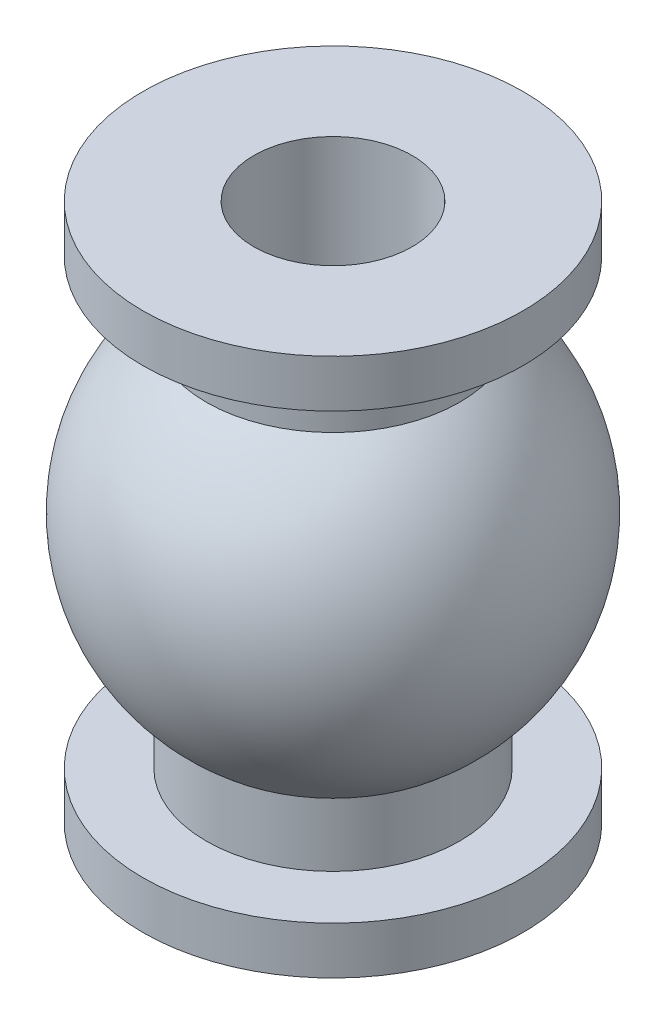
ISO-10303-21;
HEADER;
FILE_DESCRIPTION(('STEP AP214'),'2;1');
FILE_NAME('part.step','',(''),(''),'','','');
FILE_SCHEMA(('AUTOMOTIVE_DESIGN { 1 0 10303 214 1 1 1 1 }'));
ENDSEC;
DATA;
#1=APPLICATION_CONTEXT('core data for automotive mechanical design processes');
#2=APPLICATION_PROTOCOL_DEFINITION('international standard','automotive_design',2000,#1);
#3=PRODUCT_CONTEXT('',#1,'mechanical');
#4=PRODUCT('Part','Part','',(#3));
#5=PRODUCT_RELATED_PRODUCT_CATEGORY('part','',(#4));
#6=PRODUCT_DEFINITION_FORMATION('','',#4);
#7=PRODUCT_DEFINITION_CONTEXT('part definition',#1,'design');
#8=PRODUCT_DEFINITION('design','',#6,#7);
#9=PRODUCT_DEFINITION_SHAPE('','',#8);
#10=(LENGTH_UNIT() NAMED_UNIT(*) SI_UNIT(.MILLI.,.METRE.));
#11=(NAMED_UNIT(*) PLANE_ANGLE_UNIT() SI_UNIT($,.RADIAN.));
#12=(NAMED_UNIT(*) SI_UNIT($,.STERADIAN.) SOLID_ANGLE_UNIT());
#13=UNCERTAINTY_MEASURE_WITH_UNIT(LENGTH_MEASURE(1.E-05),#10,'distance_accuracy_value','');
#14=(GEOMETRIC_REPRESENTATION_CONTEXT(3) GLOBAL_UNCERTAINTY_ASSIGNED_CONTEXT((#13)) GLOBAL_UNIT_ASSIGNED_CONTEXT((#10,
#11,#12)) REPRESENTATION_CONTEXT('',''));
#15=CARTESIAN_POINT('',(0.,0.,0.));
#16=DIRECTION('',(0.,0.,1.));
#17=DIRECTION('',(1.,0.,0.));
#18=AXIS2_PLACEMENT_3D('',#15,#16,#17);
#19=CARTESIAN_POINT('',(0.,16.1142112906296,0.));
#20=DIRECTION('',(0.,1.,0.));
#21=DIRECTION('',(0.,0.,1.));
#22=AXIS2_PLACEMENT_3D('',#19,#20,#21);
#23=CYLINDRICAL_SURFACE('',#22,6.);
#24=CARTESIAN_POINT('',(0.,7.,0.));
#25=DIRECTION('',(0.,1.,0.));
#26=DIRECTION('',(0.,0.,1.));
#27=AXIS2_PLACEMENT_3D('',#24,#25,#26);
#28=CIRCLE('',#27,6.);
#29=CARTESIAN_POINT('',(0.,7.,6.));
#30=VERTEX_POINT('',#29);
#31=EDGE_CURVE('E10',#30,#30,#28,.T.);
#32=ORIENTED_EDGE('',*,*,#31,.T.);
#33=EDGE_LOOP('',(#32));
#34=FACE_BOUND('',#33,.T.);
#35=CARTESIAN_POINT('',(0.,8.5,0.));
#36=DIRECTION('',(0.,1.,0.));
#37=DIRECTION('',(0.,0.,1.));
#38=AXIS2_PLACEMENT_3D('',#35,#36,#37);
#39=CIRCLE('',#38,6.);
#40=CARTESIAN_POINT('',(0.,8.5,6.));
#41=VERTEX_POINT('',#40);
#42=EDGE_CURVE('E59',#41,#41,#39,.T.);
#43=ORIENTED_EDGE('',*,*,#42,.F.);
#44=EDGE_LOOP('',(#43));
#45=FACE_BOUND('',#44,.T.);
#46=ADVANCED_FACE('F31',(#34,#45),#23,.T.);
#47=CARTESIAN_POINT('',(-6.,7.,0.));
#48=DIRECTION('',(0.,-1.,0.));
#49=DIRECTION('',(0.,0.,-1.));
#50=AXIS2_PLACEMENT_3D('',#47,#48,#49);
#51=PLANE('',#50);
#52=CARTESIAN_POINT('',(0.,7.,0.));
#53=DIRECTION('',(0.,1.,0.));
#54=DIRECTION('',(0.,0.,1.));
#55=AXIS2_PLACEMENT_3D('',#52,#53,#54);
#56=CIRCLE('',#55,4.);
#57=CARTESIAN_POINT('',(0.,7.,4.));
#58=VERTEX_POINT('',#57);
#59=EDGE_CURVE('E37',#58,#58,#56,.T.);
#60=ORIENTED_EDGE('',*,*,#59,.T.);
#61=EDGE_LOOP('',(#60));
#62=FACE_BOUND('',#61,.T.);
#63=ORIENTED_EDGE('',*,*,#31,.F.);
#64=EDGE_LOOP('',(#63));
#65=FACE_BOUND('',#64,.T.);
#66=ADVANCED_FACE('F85',(#62,#65),#51,.T.);
#67=CARTESIAN_POINT('',(0.,16.1142112906296,0.));
#68=DIRECTION('',(0.,1.,0.));
#69=DIRECTION('',(0.,0.,1.));
#70=AXIS2_PLACEMENT_3D('',#67,#68,#69);
#71=CYLINDRICAL_SURFACE('',#70,4.);
#72=CARTESIAN_POINT('',(0.,5.,0.));
#73=DIRECTION('',(0.,1.,0.));
#74=DIRECTION('',(0.,0.,1.));
#75=AXIS2_PLACEMENT_3D('',#72,#73,#74);
#76=CIRCLE('',#75,4.);
#77=CARTESIAN_POINT('',(-4.,5.,0.));
#78=VERTEX_POINT('',#77);
#79=EDGE_CURVE('E41',#78,#78,#76,.T.);
#80=ORIENTED_EDGE('',*,*,#79,.T.);
#81=EDGE_LOOP('',(#80));
#82=FACE_BOUND('',#81,.T.);
#83=ORIENTED_EDGE('',*,*,#59,.F.);
#84=EDGE_LOOP('',(#83));
#85=FACE_BOUND('',#84,.T.);
#86=ADVANCED_FACE('F89',(#82,#85),#71,.T.);
#87=CARTESIAN_POINT('',(0.,0.,0.));
#88=DIRECTION('',(0.,1.,0.));
#89=DIRECTION('',(-1.,0.,0.));
#90=AXIS2_PLACEMENT_3D('',#87,#88,#89);
#91=SPHERICAL_SURFACE('',#90,6.40312423743285);
#92=CARTESIAN_POINT('',(0.,-5.,0.));
#93=DIRECTION('',(0.,1.,0.));
#94=DIRECTION('',(0.,0.,1.));
#95=AXIS2_PLACEMENT_3D('',#92,#93,#94);
#96=CIRCLE('',#95,4.);
#97=CARTESIAN_POINT('',(-4.,-5.,0.));
#98=VERTEX_POINT('',#97);
#99=EDGE_CURVE('E45',#98,#98,#96,.T.);
#100=CARTESIAN_POINT('',(-4.,-5.,0.));
#101=CARTESIAN_POINT('',(-4.09334161361375,-4.92533152943418,0.));
#102=CARTESIAN_POINT('',(-4.1845873974265,-4.8480438566984,0.));
#103=CARTESIAN_POINT('',(-4.36261224403933,-4.68848477215426,0.));
#104=CARTESIAN_POINT('',(-4.44939130683942,-4.60621336034591,0.));
#105=CARTESIAN_POINT('',(-4.6182076500163,-4.43694146292396,0.));
#106=CARTESIAN_POINT('',(-4.70024493039309,-4.34994097731036,0.));
#107=CARTESIAN_POINT('',(-4.85932126831225,-4.17148461308061,0.));
#108=CARTESIAN_POINT('',(-4.93636032585461,-4.08002873446446,0.));
#109=CARTESIAN_POINT('',(-5.08519844439702,-3.89294811326265,0.));
#110=CARTESIAN_POINT('',(-5.15699750539705,-3.79732337067699,0.));
#111=CARTESIAN_POINT('',(-5.29513055695284,-3.60220492295348,0.));
#112=CARTESIAN_POINT('',(-5.36146454750858,-3.50271121781564,0.));
#113=CARTESIAN_POINT('',(-5.48845944817778,-3.3001667972475,0.));
#114=CARTESIAN_POINT('',(-5.54912035829123,-3.1971160818172,0.));
#115=CARTESIAN_POINT('',(-5.66457889575253,-2.98778076775581,0.));
#116=CARTESIAN_POINT('',(-5.71937652310039,-2.88149616912472,0.));
#117=CARTESIAN_POINT('',(-5.8229366722458,-2.66602635003076,0.));
#118=CARTESIAN_POINT('',(-5.87169919404337,-2.5568411295679,0.));
#119=CARTESIAN_POINT('',(-5.96303623417655,-2.33591242482622,0.));
#120=CARTESIAN_POINT('',(-6.00561075251216,-2.22416894054742,0.));
#121=CARTESIAN_POINT('',(-6.08443829034353,-1.99847408738474,0.));
#122=CARTESIAN_POINT('',(-6.1206913098393,-1.88452271850086,0.));
#123=CARTESIAN_POINT('',(-6.18676217620255,-1.65476939842258,0.));
#124=CARTESIAN_POINT('',(-6.21658002307004,-1.53896744722818,0.));
#125=CARTESIAN_POINT('',(-6.26968704828328,-1.30587606742035,0.));
#126=CARTESIAN_POINT('',(-6.29297622662902,-1.18858663880692,0.));
#127=CARTESIAN_POINT('',(-6.33295288999685,-0.952888073147173,0.));
#128=CARTESIAN_POINT('',(-6.34964037501893,-0.834478936100859,0.));
#129=CARTESIAN_POINT('',(-6.37636132699423,-0.596912233481334,0.));
#130=CARTESIAN_POINT('',(-6.38639479394745,-0.477754667908125,0.));
#131=CARTESIAN_POINT('',(-6.39977624916676,-0.239064734889943,0.));
#132=CARTESIAN_POINT('',(-6.40312423743285,-0.11953236744497,0.));
#133=CARTESIAN_POINT('',(-6.40312423743285,0.119532367444975,0.));
#134=CARTESIAN_POINT('',(-6.39977624916676,0.239064734889947,0.));
#135=CARTESIAN_POINT('',(-6.38639479394745,0.477754667908129,0.));
#136=CARTESIAN_POINT('',(-6.37636132699423,0.596912233481338,0.));
#137=CARTESIAN_POINT('',(-6.34964037501893,0.834478936100862,0.));
#138=CARTESIAN_POINT('',(-6.33295288999685,0.952888073147177,0.));
#139=CARTESIAN_POINT('',(-6.29297622662902,1.18858663880692,0.));
#140=CARTESIAN_POINT('',(-6.26968704828328,1.30587606742035,0.));
#141=CARTESIAN_POINT('',(-6.21658002307004,1.53896744722818,0.));
#142=CARTESIAN_POINT('',(-6.18676217620255,1.65476939842258,0.));
#143=CARTESIAN_POINT('',(-6.12069130983929,1.88452271850086,0.));
#144=CARTESIAN_POINT('',(-6.08443829034353,1.99847408738474,0.));
#145=CARTESIAN_POINT('',(-6.00561075251216,2.22416894054742,0.));
#146=CARTESIAN_POINT('',(-5.96303623417655,2.33591242482623,0.));
#147=CARTESIAN_POINT('',(-5.87169919404337,2.5568411295679,0.));
#148=CARTESIAN_POINT('',(-5.8229366722458,2.66602635003076,0.));
#149=CARTESIAN_POINT('',(-5.71937652310038,2.88149616912472,0.));
#150=CARTESIAN_POINT('',(-5.66457889575253,2.98778076775582,0.));
#151=CARTESIAN_POINT('',(-5.54912035829123,3.19711608181721,0.));
#152=CARTESIAN_POINT('',(-5.48845944817778,3.3001667972475,0.));
#153=CARTESIAN_POINT('',(-5.36146454750858,3.50271121781564,0.));
#154=CARTESIAN_POINT('',(-5.29513055695283,3.60220492295349,0.));
#155=CARTESIAN_POINT('',(-5.15699750539705,3.79732337067699,0.));
#156=CARTESIAN_POINT('',(-5.08519844439701,3.89294811326265,0.));
#157=CARTESIAN_POINT('',(-4.93636032585461,4.08002873446447,0.));
#158=CARTESIAN_POINT('',(-4.85932126831225,4.17148461308062,0.));
#159=CARTESIAN_POINT('',(-4.70024493039309,4.34994097731036,0.));
#160=CARTESIAN_POINT('',(-4.6182076500163,4.43694146292396,0.));
#161=CARTESIAN_POINT('',(-4.44939130683942,4.60621336034591,0.));
#162=CARTESIAN_POINT('',(-4.36261224403933,4.68848477215427,0.));
#163=CARTESIAN_POINT('',(-4.18458739742649,4.8480438566984,0.));
#164=CARTESIAN_POINT('',(-4.09334161361375,4.92533152943418,0.));
#165=CARTESIAN_POINT('',(-4.,5.,0.));
#166=B_SPLINE_CURVE_WITH_KNOTS('',3,(#100,#101,#102,#103,#104,#105,#106,#107,#108,#109,#110,
#111,#112,#113,#114,#115,#116,#117,#118,#119,#120,#121,#122,#123,#124,#125,#126,#127,#128,#129,
#130,#131,#132,#133,#134,#135,#136,#137,#138,#139,#140,#141,#142,#143,#144,#145,#146,#147,#148,
#149,#150,#151,#152,#153,#154,#155,#156,#157,#158,#159,#160,#161,#162,#163,#164,#165),
.UNSPECIFIED.,.F.,.F.,(4,2,2,2,2,2,2,2,2,2,2,2,2,2,2,2,2,2,2,2,2,2,2,2,2,2,2,2,2,2,2,2,4),(0.,
0.358550261293141,0.717100522586282,1.07565078387942,1.43420104517257,1.79275130646571,
2.15130156775885,2.50985182905199,2.86840209034513,3.22695235163827,3.58550261293141,
3.94405287422455,4.3026031355177,4.66115339681084,5.01970365810398,5.37825391939712,
5.73680418069026,6.0953544419834,6.45390470327655,6.81245496456969,7.17100522586283,
7.52955548715597,7.88810574844911,8.24665600974225,8.60520627103539,8.96375653232854,
9.32230679362168,9.68085705491482,10.039407316208,10.3979575775011,10.7565078387942,
11.1150581000874,11.4736083613805),.UNSPECIFIED.);
#167=EDGE_CURVE('BSEAM93',#98,#78,#166,.T.);
#168=ORIENTED_EDGE('',*,*,#99,.T.);
#169=ORIENTED_EDGE('',*,*,#79,.F.);
#170=ORIENTED_EDGE('',*,*,#167,.T.);
#171=ORIENTED_EDGE('',*,*,#167,.F.);
#172=EDGE_LOOP('',(#168,#170,#169,#171));
#173=FACE_BOUND('',#172,.T.);
#174=ADVANCED_FACE('F93',(#173),#91,.T.);
#175=CARTESIAN_POINT('',(0.,16.1142112906296,0.));
#176=DIRECTION('',(0.,1.,0.));
#177=DIRECTION('',(0.,0.,1.));
#178=AXIS2_PLACEMENT_3D('',#175,#176,#177);
#179=CYLINDRICAL_SURFACE('',#178,4.);
#180=CARTESIAN_POINT('',(0.,-7.,0.));
#181=DIRECTION('',(0.,1.,0.));
#182=DIRECTION('',(0.,0.,1.));
#183=AXIS2_PLACEMENT_3D('',#180,#181,#182);
#184=CIRCLE('',#183,4.);
#185=CARTESIAN_POINT('',(0.,-7.,4.));
#186=VERTEX_POINT('',#185);
#187=EDGE_CURVE('E50',#186,#186,#184,.T.);
#188=ORIENTED_EDGE('',*,*,#187,.T.);
#189=EDGE_LOOP('',(#188));
#190=FACE_BOUND('',#189,.T.);
#191=ORIENTED_EDGE('',*,*,#99,.F.);
#192=EDGE_LOOP('',(#191));
#193=FACE_BOUND('',#192,.T.);
#194=ADVANCED_FACE('F100',(#190,#193),#179,.T.);
#195=CARTESIAN_POINT('',(-6.,-7.,0.));
#196=DIRECTION('',(0.,1.,0.));
#197=DIRECTION('',(0.,0.,1.));
#198=AXIS2_PLACEMENT_3D('',#195,#196,#197);
#199=PLANE('',#198);
#200=CARTESIAN_POINT('',(0.,-7.,0.));
#201=DIRECTION('',(0.,1.,0.));
#202=DIRECTION('',(0.,0.,1.));
#203=AXIS2_PLACEMENT_3D('',#200,#201,#202);
#204=CIRCLE('',#203,6.);
#205=CARTESIAN_POINT('',(0.,-7.,6.));
#206=VERTEX_POINT('',#205);
#207=EDGE_CURVE('E53',#206,#206,#204,.T.);
#208=ORIENTED_EDGE('',*,*,#207,.T.);
#209=EDGE_LOOP('',(#208));
#210=FACE_BOUND('',#209,.T.);
#211=ORIENTED_EDGE('',*,*,#187,.F.);
#212=EDGE_LOOP('',(#211));
#213=FACE_BOUND('',#212,.T.);
#214=ADVANCED_FACE('F104',(#210,#213),#199,.T.);
#215=CARTESIAN_POINT('',(0.,16.1142112906296,0.));
#216=DIRECTION('',(0.,1.,0.));
#217=DIRECTION('',(0.,0.,1.));
#218=AXIS2_PLACEMENT_3D('',#215,#216,#217);
#219=CYLINDRICAL_SURFACE('',#218,6.);
#220=CARTESIAN_POINT('',(0.,-8.5,0.));
#221=DIRECTION('',(0.,1.,0.));
#222=DIRECTION('',(0.,0.,1.));
#223=AXIS2_PLACEMENT_3D('',#220,#221,#222);
#224=CIRCLE('',#223,6.);
#225=CARTESIAN_POINT('',(0.,-8.5,6.));
#226=VERTEX_POINT('',#225);
#227=EDGE_CURVE('E56',#226,#226,#224,.T.);
#228=ORIENTED_EDGE('',*,*,#227,.T.);
#229=EDGE_LOOP('',(#228));
#230=FACE_BOUND('',#229,.T.);
#231=ORIENTED_EDGE('',*,*,#207,.F.);
#232=EDGE_LOOP('',(#231));
#233=FACE_BOUND('',#232,.T.);
#234=ADVANCED_FACE('F108',(#230,#233),#219,.T.);
#235=CARTESIAN_POINT('',(0.,-8.5,0.));
#236=DIRECTION('',(0.,-1.,0.));
#237=DIRECTION('',(0.,0.,-1.));
#238=AXIS2_PLACEMENT_3D('',#235,#236,#237);
#239=PLANE('',#238);
#240=CARTESIAN_POINT('',(0.,-8.5,0.));
#241=DIRECTION('',(0.,1.,0.));
#242=DIRECTION('',(0.,0.,1.));
#243=AXIS2_PLACEMENT_3D('',#240,#241,#242);
#244=CIRCLE('',#243,2.5);
#245=CARTESIAN_POINT('',(0.,-8.5,2.5));
#246=VERTEX_POINT('',#245);
#247=EDGE_CURVE('E62',#246,#246,#244,.T.);
#248=ORIENTED_EDGE('',*,*,#247,.T.);
#249=EDGE_LOOP('',(#248));
#250=FACE_BOUND('',#249,.T.);
#251=ORIENTED_EDGE('',*,*,#227,.F.);
#252=EDGE_LOOP('',(#251));
#253=FACE_BOUND('',#252,.T.);
#254=ADVANCED_FACE('F69',(#250,#253),#239,.T.);
#255=CARTESIAN_POINT('',(0.,8.5,0.));
#256=DIRECTION('',(0.,1.,0.));
#257=DIRECTION('',(0.,0.,1.));
#258=AXIS2_PLACEMENT_3D('',#255,#256,#257);
#259=PLANE('',#258);
#260=CARTESIAN_POINT('',(0.,8.5,0.));
#261=DIRECTION('',(0.,1.,0.));
#262=DIRECTION('',(0.,0.,1.));
#263=AXIS2_PLACEMENT_3D('',#260,#261,#262);
#264=CIRCLE('',#263,2.5);
#265=CARTESIAN_POINT('',(0.,8.5,2.5));
#266=VERTEX_POINT('',#265);
#267=EDGE_CURVE('E63',#266,#266,#264,.T.);
#268=ORIENTED_EDGE('',*,*,#267,.F.);
#269=EDGE_LOOP('',(#268));
#270=FACE_BOUND('',#269,.T.);
#271=ORIENTED_EDGE('',*,*,#42,.T.);
#272=EDGE_LOOP('',(#271));
#273=FACE_BOUND('',#272,.T.);
#274=ADVANCED_FACE('F75',(#270,#273),#259,.T.);
#275=CARTESIAN_POINT('',(0.,-8.5,0.));
#276=DIRECTION('',(0.,1.,0.));
#277=DIRECTION('',(0.,0.,1.));
#278=AXIS2_PLACEMENT_3D('',#275,#276,#277);
#279=CYLINDRICAL_SURFACE('',#278,2.5);
#280=ORIENTED_EDGE('',*,*,#247,.F.);
#281=EDGE_LOOP('',(#280));
#282=FACE_BOUND('',#281,.T.);
#283=ORIENTED_EDGE('',*,*,#267,.T.);
#284=EDGE_LOOP('',(#283));
#285=FACE_BOUND('',#284,.T.);
#286=ADVANCED_FACE('F72',(#282,#285),#279,.F.);
#287=CLOSED_SHELL('',(#46,#66,#86,#174,#194,#214,#234,#254,#274,#286));
#288=MANIFOLD_SOLID_BREP('B2',#287);
#289=ADVANCED_BREP_SHAPE_REPRESENTATION('',(#18,#288),#14);
#290=SHAPE_DEFINITION_REPRESENTATION(#9,#289);
ENDSEC;
END-ISO-10303-21;
